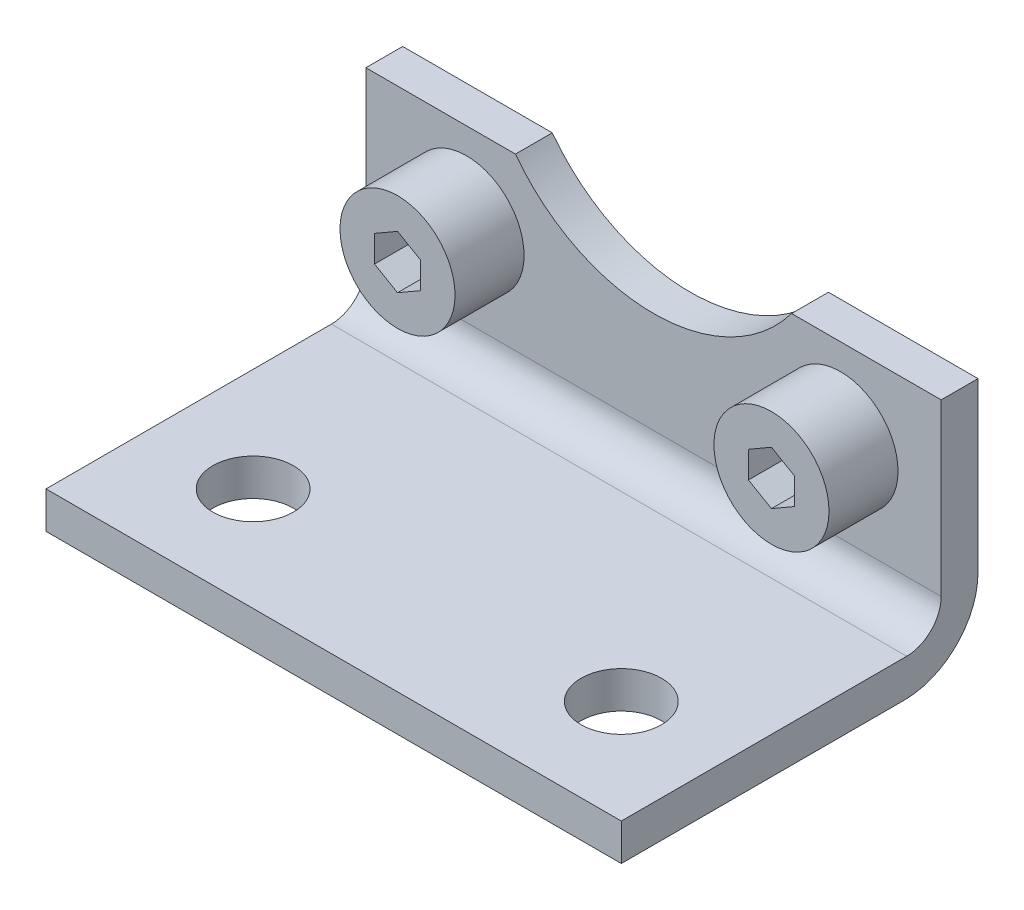
ISO-10303-21;
HEADER;
FILE_DESCRIPTION(('STEP AP214'),'2;1');
FILE_NAME('part.step','',(''),(''),'','','');
FILE_SCHEMA(('AUTOMOTIVE_DESIGN { 1 0 10303 214 1 1 1 1 }'));
ENDSEC;
DATA;
#1=APPLICATION_CONTEXT('core data for automotive mechanical design processes');
#2=APPLICATION_PROTOCOL_DEFINITION('international standard','automotive_design',2000,#1);
#3=PRODUCT_CONTEXT('',#1,'mechanical');
#4=PRODUCT('Part','Part','',(#3));
#5=PRODUCT_RELATED_PRODUCT_CATEGORY('part','',(#4));
#6=PRODUCT_DEFINITION_FORMATION('','',#4);
#7=PRODUCT_DEFINITION_CONTEXT('part definition',#1,'design');
#8=PRODUCT_DEFINITION('design','',#6,#7);
#9=PRODUCT_DEFINITION_SHAPE('','',#8);
#10=(LENGTH_UNIT() NAMED_UNIT(*) SI_UNIT(.MILLI.,.METRE.));
#11=(NAMED_UNIT(*) PLANE_ANGLE_UNIT() SI_UNIT($,.RADIAN.));
#12=(NAMED_UNIT(*) SI_UNIT($,.STERADIAN.) SOLID_ANGLE_UNIT());
#13=UNCERTAINTY_MEASURE_WITH_UNIT(LENGTH_MEASURE(1.E-05),#10,'distance_accuracy_value','');
#14=(GEOMETRIC_REPRESENTATION_CONTEXT(3) GLOBAL_UNCERTAINTY_ASSIGNED_CONTEXT((#13)) GLOBAL_UNIT_ASSIGNED_CONTEXT((#10,
#11,#12)) REPRESENTATION_CONTEXT('',''));
#15=CARTESIAN_POINT('',(0.,0.,0.));
#16=DIRECTION('',(0.,0.,1.));
#17=DIRECTION('',(1.,0.,0.));
#18=AXIS2_PLACEMENT_3D('',#15,#16,#17);
#19=CARTESIAN_POINT('',(-25.,-9.,3.1999999999999));
#20=DIRECTION('',(0.,1.,0.));
#21=DIRECTION('',(1.,0.,0.));
#22=AXIS2_PLACEMENT_3D('',#19,#20,#21);
#23=PLANE('',#22);
#24=DIRECTION('',(0.,0.,-1.));
#25=VECTOR('',#24,1.);
#26=CARTESIAN_POINT('',(-12.,-9.,3.1999999999999));
#27=LINE('',#26,#25);
#28=CARTESIAN_POINT('',(-12.,-9.,0.));
#29=VERTEX_POINT('',#28);
#30=CARTESIAN_POINT('',(-12.,-9.,3.1999999999999));
#31=VERTEX_POINT('',#30);
#32=EDGE_CURVE('E168',#29,#31,#27,.F.);
#33=ORIENTED_EDGE('',*,*,#32,.F.);
#34=DIRECTION('',(-1.,0.,0.));
#35=VECTOR('',#34,1.);
#36=CARTESIAN_POINT('',(-12.,-9.,0.));
#37=LINE('',#36,#35);
#38=CARTESIAN_POINT('',(-25.,-9.,0.));
#39=VERTEX_POINT('',#38);
#40=EDGE_CURVE('E183',#29,#39,#37,.T.);
#41=ORIENTED_EDGE('',*,*,#40,.T.);
#42=DIRECTION('',(0.,0.,1.));
#43=VECTOR('',#42,1.);
#44=CARTESIAN_POINT('',(-25.,-9.,0.));
#45=LINE('',#44,#43);
#46=CARTESIAN_POINT('',(-25.,-9.,3.1999999999999));
#47=VERTEX_POINT('',#46);
#48=EDGE_CURVE('E191',#39,#47,#45,.T.);
#49=ORIENTED_EDGE('',*,*,#48,.T.);
#50=DIRECTION('',(1.,0.,0.));
#51=VECTOR('',#50,1.);
#52=CARTESIAN_POINT('',(-25.,-9.,3.1999999999999));
#53=LINE('',#52,#51);
#54=EDGE_CURVE('E185',#31,#47,#53,.F.);
#55=ORIENTED_EDGE('',*,*,#54,.F.);
#56=EDGE_LOOP('',(#33,#41,#49,#55));
#57=FACE_BOUND('',#56,.T.);
#58=ADVANCED_FACE('F17',(#57),#23,.T.);
#59=CARTESIAN_POINT('',(12.,-9.,3.2));
#60=DIRECTION('',(0.,1.,0.));
#61=DIRECTION('',(1.,0.,0.));
#62=AXIS2_PLACEMENT_3D('',#59,#60,#61);
#63=PLANE('',#62);
#64=DIRECTION('',(0.,0.,1.));
#65=VECTOR('',#64,1.);
#66=CARTESIAN_POINT('',(12.,-9.,0.));
#67=LINE('',#66,#65);
#68=CARTESIAN_POINT('',(12.,-9.,3.19999999999998));
#69=VERTEX_POINT('',#68);
#70=CARTESIAN_POINT('',(12.,-9.,0.));
#71=VERTEX_POINT('',#70);
#72=EDGE_CURVE('E171',#69,#71,#67,.F.);
#73=ORIENTED_EDGE('',*,*,#72,.F.);
#74=DIRECTION('',(1.,0.,0.));
#75=VECTOR('',#74,1.);
#76=CARTESIAN_POINT('',(12.,-9.,3.19999999999998));
#77=LINE('',#76,#75);
#78=CARTESIAN_POINT('',(25.,-9.,3.1999999999999));
#79=VERTEX_POINT('',#78);
#80=EDGE_CURVE('E205',#79,#69,#77,.F.);
#81=ORIENTED_EDGE('',*,*,#80,.F.);
#82=DIRECTION('',(0.,0.,-1.));
#83=VECTOR('',#82,1.);
#84=CARTESIAN_POINT('',(25.,-9.,3.1999999999999));
#85=LINE('',#84,#83);
#86=CARTESIAN_POINT('',(25.,-9.,0.));
#87=VERTEX_POINT('',#86);
#88=EDGE_CURVE('E210',#87,#79,#85,.F.);
#89=ORIENTED_EDGE('',*,*,#88,.F.);
#90=DIRECTION('',(-1.,0.,0.));
#91=VECTOR('',#90,1.);
#92=CARTESIAN_POINT('',(25.,-9.,0.));
#93=LINE('',#92,#91);
#94=EDGE_CURVE('E214',#87,#71,#93,.T.);
#95=ORIENTED_EDGE('',*,*,#94,.T.);
#96=EDGE_LOOP('',(#73,#81,#89,#95));
#97=FACE_BOUND('',#96,.T.);
#98=ADVANCED_FACE('F532',(#97),#63,.T.);
#99=CARTESIAN_POINT('',(-25.,-26.8,31.));
#100=DIRECTION('',(0.,1.,0.));
#101=DIRECTION('',(1.,0.,0.));
#102=AXIS2_PLACEMENT_3D('',#99,#100,#101);
#103=PLANE('',#102);
#104=DIRECTION('',(0.,0.,1.));
#105=VECTOR('',#104,1.);
#106=CARTESIAN_POINT('',(-25.,-26.8,6.2));
#107=LINE('',#106,#105);
#108=CARTESIAN_POINT('',(-25.,-26.8,6.2));
#109=VERTEX_POINT('',#108);
#110=CARTESIAN_POINT('',(-25.,-26.8,31.));
#111=VERTEX_POINT('',#110);
#112=EDGE_CURVE('E218',#109,#111,#107,.T.);
#113=ORIENTED_EDGE('',*,*,#112,.T.);
#114=DIRECTION('',(1.,0.,0.));
#115=VECTOR('',#114,1.);
#116=CARTESIAN_POINT('',(-25.,-26.8,31.));
#117=LINE('',#116,#115);
#118=CARTESIAN_POINT('',(25.,-26.8,31.));
#119=VERTEX_POINT('',#118);
#120=EDGE_CURVE('E223',#119,#111,#117,.F.);
#121=ORIENTED_EDGE('',*,*,#120,.F.);
#122=DIRECTION('',(0.,0.,-1.));
#123=VECTOR('',#122,1.);
#124=CARTESIAN_POINT('',(25.,-26.8,31.));
#125=LINE('',#124,#123);
#126=CARTESIAN_POINT('',(25.,-26.8,6.2));
#127=VERTEX_POINT('',#126);
#128=EDGE_CURVE('E228',#127,#119,#125,.F.);
#129=ORIENTED_EDGE('',*,*,#128,.F.);
#130=DIRECTION('',(-1.,0.,0.));
#131=VECTOR('',#130,1.);
#132=CARTESIAN_POINT('',(25.,-26.8,6.2));
#133=LINE('',#132,#131);
#134=EDGE_CURVE('E232',#127,#109,#133,.T.);
#135=ORIENTED_EDGE('',*,*,#134,.T.);
#136=EDGE_LOOP('',(#113,#121,#129,#135));
#137=FACE_BOUND('',#136,.T.);
#138=CARTESIAN_POINT('',(16.,-26.8,22.));
#139=DIRECTION('',(0.,-1.,0.));
#140=DIRECTION('',(-1.42053810999903E-07,0.,0.99999999999999));
#141=AXIS2_PLACEMENT_3D('',#138,#139,#140);
#142=CIRCLE('',#141,3.5);
#143=CARTESIAN_POINT('',(15.9999995028117,-26.8,25.5));
#144=VERTEX_POINT('',#143);
#145=EDGE_CURVE('E237',#144,#144,#142,.T.);
#146=ORIENTED_EDGE('',*,*,#145,.T.);
#147=EDGE_LOOP('',(#146));
#148=FACE_BOUND('',#147,.T.);
#149=CARTESIAN_POINT('',(-16.,-26.8,22.));
#150=DIRECTION('',(0.,-1.,0.));
#151=DIRECTION('',(-1.42053924686741E-07,0.,0.99999999999999));
#152=AXIS2_PLACEMENT_3D('',#149,#150,#151);
#153=CIRCLE('',#152,3.5);
#154=CARTESIAN_POINT('',(-16.0000004971887,-26.8,25.5));
#155=VERTEX_POINT('',#154);
#156=EDGE_CURVE('E242',#155,#155,#153,.T.);
#157=ORIENTED_EDGE('',*,*,#156,.T.);
#158=EDGE_LOOP('',(#157));
#159=FACE_BOUND('',#158,.T.);
#160=ADVANCED_FACE('F537',(#137,#148,#159),#103,.T.);
#161=CARTESIAN_POINT('',(25.,-30.,31.));
#162=DIRECTION('',(0.,0.,1.));
#163=DIRECTION('',(0.,1.,0.));
#164=AXIS2_PLACEMENT_3D('',#161,#162,#163);
#165=PLANE('',#164);
#166=DIRECTION('',(0.,-1.,0.));
#167=VECTOR('',#166,1.);
#168=CARTESIAN_POINT('',(-25.,-26.8,31.));
#169=LINE('',#168,#167);
#170=CARTESIAN_POINT('',(-25.,-30.,31.));
#171=VERTEX_POINT('',#170);
#172=EDGE_CURVE('E245',#111,#171,#169,.T.);
#173=ORIENTED_EDGE('',*,*,#172,.T.);
#174=DIRECTION('',(1.,0.,0.));
#175=VECTOR('',#174,1.);
#176=CARTESIAN_POINT('',(-25.,-30.,31.));
#177=LINE('',#176,#175);
#178=CARTESIAN_POINT('',(25.,-30.,31.));
#179=VERTEX_POINT('',#178);
#180=EDGE_CURVE('E248',#179,#171,#177,.F.);
#181=ORIENTED_EDGE('',*,*,#180,.F.);
#182=DIRECTION('',(0.,1.,0.));
#183=VECTOR('',#182,1.);
#184=CARTESIAN_POINT('',(25.,-30.,31.));
#185=LINE('',#184,#183);
#186=EDGE_CURVE('E253',#119,#179,#185,.F.);
#187=ORIENTED_EDGE('',*,*,#186,.F.);
#188=ORIENTED_EDGE('',*,*,#120,.T.);
#189=EDGE_LOOP('',(#173,#181,#187,#188));
#190=FACE_BOUND('',#189,.T.);
#191=ADVANCED_FACE('F543',(#190),#165,.T.);
#192=CARTESIAN_POINT('',(-25.,-30.,6.4));
#193=DIRECTION('',(0.,-1.,0.));
#194=DIRECTION('',(1.,0.,0.));
#195=AXIS2_PLACEMENT_3D('',#192,#193,#194);
#196=PLANE('',#195);
#197=DIRECTION('',(0.,0.,-1.));
#198=VECTOR('',#197,1.);
#199=CARTESIAN_POINT('',(-25.,-30.,31.));
#200=LINE('',#199,#198);
#201=CARTESIAN_POINT('',(-25.,-30.,6.4));
#202=VERTEX_POINT('',#201);
#203=EDGE_CURVE('E257',#171,#202,#200,.T.);
#204=ORIENTED_EDGE('',*,*,#203,.T.);
#205=DIRECTION('',(1.,0.,0.));
#206=VECTOR('',#205,1.);
#207=CARTESIAN_POINT('',(-25.,-30.,6.4));
#208=LINE('',#207,#206);
#209=CARTESIAN_POINT('',(25.,-30.,6.4));
#210=VERTEX_POINT('',#209);
#211=EDGE_CURVE('E262',#210,#202,#208,.F.);
#212=ORIENTED_EDGE('',*,*,#211,.F.);
#213=DIRECTION('',(0.,0.,1.));
#214=VECTOR('',#213,1.);
#215=CARTESIAN_POINT('',(25.,-30.,6.4));
#216=LINE('',#215,#214);
#217=EDGE_CURVE('E267',#179,#210,#216,.F.);
#218=ORIENTED_EDGE('',*,*,#217,.F.);
#219=ORIENTED_EDGE('',*,*,#180,.T.);
#220=EDGE_LOOP('',(#204,#212,#218,#219));
#221=FACE_BOUND('',#220,.T.);
#222=CARTESIAN_POINT('',(16.,-30.,22.));
#223=DIRECTION('',(0.,1.,0.));
#224=DIRECTION('',(0.,0.,-1.));
#225=AXIS2_PLACEMENT_3D('',#222,#223,#224);
#226=CIRCLE('',#225,3.5);
#227=CARTESIAN_POINT('',(16.,-30.,18.5));
#228=VERTEX_POINT('',#227);
#229=EDGE_CURVE('E271',#228,#228,#226,.T.);
#230=ORIENTED_EDGE('',*,*,#229,.T.);
#231=EDGE_LOOP('',(#230));
#232=FACE_BOUND('',#231,.T.);
#233=CARTESIAN_POINT('',(-16.,-30.,22.));
#234=DIRECTION('',(0.,1.,0.));
#235=DIRECTION('',(0.,0.,-1.));
#236=AXIS2_PLACEMENT_3D('',#233,#234,#235);
#237=CIRCLE('',#236,3.5);
#238=CARTESIAN_POINT('',(-16.,-30.,18.5));
#239=VERTEX_POINT('',#238);
#240=EDGE_CURVE('E276',#239,#239,#237,.T.);
#241=ORIENTED_EDGE('',*,*,#240,.T.);
#242=EDGE_LOOP('',(#241));
#243=FACE_BOUND('',#242,.T.);
#244=ADVANCED_FACE('F547',(#221,#232,#243),#196,.T.);
#245=CARTESIAN_POINT('',(25.,-23.6,6.39999999999984));
#246=DIRECTION('',(-1.,0.,0.));
#247=DIRECTION('',(0.,0.,-1.));
#248=AXIS2_PLACEMENT_3D('',#245,#246,#247);
#249=CYLINDRICAL_SURFACE('',#248,6.39999999999984);
#250=CARTESIAN_POINT('',(-25.,-23.6,6.39999999999984));
#251=DIRECTION('',(1.,0.,0.));
#252=DIRECTION('',(0.,-1.,0.));
#253=AXIS2_PLACEMENT_3D('',#250,#251,#252);
#254=CIRCLE('',#253,6.39999999999984);
#255=CARTESIAN_POINT('',(-25.,-23.6,0.));
#256=VERTEX_POINT('',#255);
#257=EDGE_CURVE('E279',#202,#256,#254,.T.);
#258=ORIENTED_EDGE('',*,*,#257,.T.);
#259=DIRECTION('',(1.,0.,0.));
#260=VECTOR('',#259,1.);
#261=CARTESIAN_POINT('',(-25.,-23.6,0.));
#262=LINE('',#261,#260);
#263=CARTESIAN_POINT('',(25.,-23.6,0.));
#264=VERTEX_POINT('',#263);
#265=EDGE_CURVE('E282',#264,#256,#262,.F.);
#266=ORIENTED_EDGE('',*,*,#265,.F.);
#267=CARTESIAN_POINT('',(25.,-23.6,6.39999999999984));
#268=DIRECTION('',(-1.,0.,0.));
#269=DIRECTION('',(0.,0.,-1.));
#270=AXIS2_PLACEMENT_3D('',#267,#268,#269);
#271=CIRCLE('',#270,6.39999999999984);
#272=EDGE_CURVE('E177',#210,#264,#271,.F.);
#273=ORIENTED_EDGE('',*,*,#272,.F.);
#274=ORIENTED_EDGE('',*,*,#211,.T.);
#275=EDGE_LOOP('',(#258,#266,#273,#274));
#276=FACE_BOUND('',#275,.T.);
#277=ADVANCED_FACE('F551',(#276),#249,.T.);
#278=CARTESIAN_POINT('',(-25.,-23.6,0.));
#279=DIRECTION('',(0.,0.,-1.));
#280=DIRECTION('',(0.,1.,0.));
#281=AXIS2_PLACEMENT_3D('',#278,#279,#280);
#282=PLANE('',#281);
#283=CARTESIAN_POINT('',(0.,0.,0.));
#284=DIRECTION('',(0.,0.,1.));
#285=DIRECTION('',(-0.8,-0.6,0.));
#286=AXIS2_PLACEMENT_3D('',#283,#284,#285);
#287=CIRCLE('',#286,15.);
#288=EDGE_CURVE('E165',#71,#29,#287,.F.);
#289=ORIENTED_EDGE('',*,*,#288,.F.);
#290=ORIENTED_EDGE('',*,*,#94,.F.);
#291=DIRECTION('',(0.,-1.,0.));
#292=VECTOR('',#291,1.);
#293=CARTESIAN_POINT('',(25.,-9.00000000000001,0.));
#294=LINE('',#293,#292);
#295=EDGE_CURVE('E176',#264,#87,#294,.F.);
#296=ORIENTED_EDGE('',*,*,#295,.F.);
#297=ORIENTED_EDGE('',*,*,#265,.T.);
#298=DIRECTION('',(0.,1.,0.));
#299=VECTOR('',#298,1.);
#300=CARTESIAN_POINT('',(-25.,-23.6,0.));
#301=LINE('',#300,#299);
#302=EDGE_CURVE('E190',#256,#39,#301,.T.);
#303=ORIENTED_EDGE('',*,*,#302,.T.);
#304=ORIENTED_EDGE('',*,*,#40,.F.);
#305=EDGE_LOOP('',(#289,#290,#296,#297,#303,#304));
#306=FACE_BOUND('',#305,.T.);
#307=ADVANCED_FACE('F188',(#306),#282,.T.);
#308=CARTESIAN_POINT('',(-25.,-23.8000000000001,3.2));
#309=DIRECTION('',(0.,0.,1.));
#310=DIRECTION('',(1.,0.,0.));
#311=AXIS2_PLACEMENT_3D('',#308,#309,#310);
#312=PLANE('',#311);
#313=CARTESIAN_POINT('',(0.,0.,3.2));
#314=DIRECTION('',(0.,0.,-1.));
#315=DIRECTION('',(0.8,-0.600000000000001,0.));
#316=AXIS2_PLACEMENT_3D('',#313,#314,#315);
#317=CIRCLE('',#316,15.);
#318=EDGE_CURVE('E297',#31,#69,#317,.F.);
#319=ORIENTED_EDGE('',*,*,#318,.F.);
#320=ORIENTED_EDGE('',*,*,#54,.T.);
#321=DIRECTION('',(0.,-1.,0.));
#322=VECTOR('',#321,1.);
#323=CARTESIAN_POINT('',(-25.,-9.,3.1999999999999));
#324=LINE('',#323,#322);
#325=CARTESIAN_POINT('',(-25.,-23.8000000000001,3.2));
#326=VERTEX_POINT('',#325);
#327=EDGE_CURVE('E301',#47,#326,#324,.T.);
#328=ORIENTED_EDGE('',*,*,#327,.T.);
#329=DIRECTION('',(1.,0.,0.));
#330=VECTOR('',#329,1.);
#331=CARTESIAN_POINT('',(-25.,-23.8000000000001,3.2));
#332=LINE('',#331,#330);
#333=CARTESIAN_POINT('',(25.,-23.8000000000001,3.2));
#334=VERTEX_POINT('',#333);
#335=EDGE_CURVE('E306',#334,#326,#332,.F.);
#336=ORIENTED_EDGE('',*,*,#335,.F.);
#337=DIRECTION('',(0.,1.,0.));
#338=VECTOR('',#337,1.);
#339=CARTESIAN_POINT('',(25.,-23.8000000000001,3.2));
#340=LINE('',#339,#338);
#341=EDGE_CURVE('E311',#79,#334,#340,.F.);
#342=ORIENTED_EDGE('',*,*,#341,.F.);
#343=ORIENTED_EDGE('',*,*,#80,.T.);
#344=EDGE_LOOP('',(#319,#320,#328,#336,#342,#343));
#345=FACE_BOUND('',#344,.T.);
#346=CARTESIAN_POINT('',(16.25,-16.25,3.2));
#347=DIRECTION('',(0.,0.,-1.));
#348=DIRECTION('',(1.,0.,0.));
#349=AXIS2_PLACEMENT_3D('',#346,#347,#348);
#350=CIRCLE('',#349,5.);
#351=CARTESIAN_POINT('',(21.25,-16.25,3.2));
#352=VERTEX_POINT('',#351);
#353=EDGE_CURVE('E315',#352,#352,#350,.F.);
#354=ORIENTED_EDGE('',*,*,#353,.F.);
#355=EDGE_LOOP('',(#354));
#356=FACE_BOUND('',#355,.T.);
#357=CARTESIAN_POINT('',(-16.25,-16.25,3.2));
#358=DIRECTION('',(0.,0.,-1.));
#359=DIRECTION('',(1.,0.,0.));
#360=AXIS2_PLACEMENT_3D('',#357,#358,#359);
#361=CIRCLE('',#360,5.);
#362=CARTESIAN_POINT('',(-11.25,-16.25,3.2));
#363=VERTEX_POINT('',#362);
#364=EDGE_CURVE('E320',#363,#363,#361,.F.);
#365=ORIENTED_EDGE('',*,*,#364,.F.);
#366=EDGE_LOOP('',(#365));
#367=FACE_BOUND('',#366,.T.);
#368=ADVANCED_FACE('F558',(#345,#356,#367),#312,.T.);
#369=CARTESIAN_POINT('',(25.,-23.8000000000006,6.19999999999946));
#370=DIRECTION('',(-1.,0.,0.));
#371=DIRECTION('',(0.,1.63547293904738E-13,-1.));
#372=AXIS2_PLACEMENT_3D('',#369,#370,#371);
#373=CYLINDRICAL_SURFACE('',#372,2.99999999999946);
#374=CARTESIAN_POINT('',(-25.,-23.8000000000006,6.19999999999946));
#375=DIRECTION('',(-1.,0.,0.));
#376=DIRECTION('',(0.,1.63424829224852E-13,-1.));
#377=AXIS2_PLACEMENT_3D('',#374,#375,#376);
#378=CIRCLE('',#377,2.99999999999946);
#379=EDGE_CURVE('E323',#109,#326,#378,.F.);
#380=ORIENTED_EDGE('',*,*,#379,.F.);
#381=ORIENTED_EDGE('',*,*,#134,.F.);
#382=CARTESIAN_POINT('',(25.,-23.8000000000006,6.19999999999946));
#383=DIRECTION('',(1.,0.,0.));
#384=DIRECTION('',(0.,-1.,1.80892338145625E-13));
#385=AXIS2_PLACEMENT_3D('',#382,#383,#384);
#386=CIRCLE('',#385,2.99999999999946);
#387=EDGE_CURVE('E325',#127,#334,#386,.T.);
#388=ORIENTED_EDGE('',*,*,#387,.T.);
#389=ORIENTED_EDGE('',*,*,#335,.T.);
#390=EDGE_LOOP('',(#380,#381,#388,#389));
#391=FACE_BOUND('',#390,.T.);
#392=ADVANCED_FACE('F561',(#391),#373,.F.);
#393=CARTESIAN_POINT('',(25.,-30.,31.));
#394=DIRECTION('',(1.,0.,0.));
#395=DIRECTION('',(0.,0.,-1.));
#396=AXIS2_PLACEMENT_3D('',#393,#394,#395);
#397=PLANE('',#396);
#398=ORIENTED_EDGE('',*,*,#128,.T.);
#399=ORIENTED_EDGE('',*,*,#186,.T.);
#400=ORIENTED_EDGE('',*,*,#217,.T.);
#401=ORIENTED_EDGE('',*,*,#272,.T.);
#402=ORIENTED_EDGE('',*,*,#295,.T.);
#403=ORIENTED_EDGE('',*,*,#88,.T.);
#404=ORIENTED_EDGE('',*,*,#341,.T.);
#405=ORIENTED_EDGE('',*,*,#387,.F.);
#406=EDGE_LOOP('',(#398,#399,#400,#401,#402,#403,#404,#405));
#407=FACE_BOUND('',#406,.T.);
#408=ADVANCED_FACE('F565',(#407),#397,.T.);
#409=CARTESIAN_POINT('',(-25.,-30.,31.));
#410=DIRECTION('',(-1.,0.,0.));
#411=DIRECTION('',(0.,1.,0.));
#412=AXIS2_PLACEMENT_3D('',#409,#410,#411);
#413=PLANE('',#412);
#414=ORIENTED_EDGE('',*,*,#112,.F.);
#415=ORIENTED_EDGE('',*,*,#379,.T.);
#416=ORIENTED_EDGE('',*,*,#327,.F.);
#417=ORIENTED_EDGE('',*,*,#48,.F.);
#418=ORIENTED_EDGE('',*,*,#302,.F.);
#419=ORIENTED_EDGE('',*,*,#257,.F.);
#420=ORIENTED_EDGE('',*,*,#203,.F.);
#421=ORIENTED_EDGE('',*,*,#172,.F.);
#422=EDGE_LOOP('',(#414,#415,#416,#417,#418,#419,#420,#421));
#423=FACE_BOUND('',#422,.T.);
#424=ADVANCED_FACE('F569',(#423),#413,.T.);
#425=CARTESIAN_POINT('',(0.,0.,3.2));
#426=DIRECTION('',(0.,0.,-1.));
#427=DIRECTION('',(0.8,-0.6,0.));
#428=AXIS2_PLACEMENT_3D('',#425,#426,#427);
#429=CYLINDRICAL_SURFACE('',#428,15.);
#430=ORIENTED_EDGE('',*,*,#32,.T.);
#431=ORIENTED_EDGE('',*,*,#318,.T.);
#432=ORIENTED_EDGE('',*,*,#72,.T.);
#433=ORIENTED_EDGE('',*,*,#288,.T.);
#434=EDGE_LOOP('',(#430,#431,#432,#433));
#435=FACE_BOUND('',#434,.T.);
#436=ADVANCED_FACE('F167',(#435),#429,.F.);
#437=CARTESIAN_POINT('',(14.25,-17.404700538379,9.2));
#438=DIRECTION('',(1.,0.,0.));
#439=DIRECTION('',(0.,0.,-1.));
#440=AXIS2_PLACEMENT_3D('',#437,#438,#439);
#441=PLANE('',#440);
#442=DIRECTION('',(0.,1.,0.));
#443=VECTOR('',#442,1.);
#444=CARTESIAN_POINT('',(14.25,-17.404700538379,3.2));
#445=LINE('',#444,#443);
#446=CARTESIAN_POINT('',(14.25,-15.095299461621,3.19999999999995));
#447=VERTEX_POINT('',#446);
#448=CARTESIAN_POINT('',(14.25,-17.404700538379,3.2));
#449=VERTEX_POINT('',#448);
#450=EDGE_CURVE('E330',#447,#449,#445,.F.);
#451=ORIENTED_EDGE('',*,*,#450,.F.);
#452=DIRECTION('',(0.,0.,1.));
#453=VECTOR('',#452,1.);
#454=CARTESIAN_POINT('',(14.25,-15.095299461621,3.19999999999995));
#455=LINE('',#454,#453);
#456=CARTESIAN_POINT('',(14.25,-15.095299461621,9.2));
#457=VERTEX_POINT('',#456);
#458=EDGE_CURVE('E334',#457,#447,#455,.F.);
#459=ORIENTED_EDGE('',*,*,#458,.F.);
#460=DIRECTION('',(0.,-1.,0.));
#461=VECTOR('',#460,1.);
#462=CARTESIAN_POINT('',(14.25,-15.095299461621,9.2));
#463=LINE('',#462,#461);
#464=CARTESIAN_POINT('',(14.25,-17.404700538379,9.2));
#465=VERTEX_POINT('',#464);
#466=EDGE_CURVE('E339',#457,#465,#463,.T.);
#467=ORIENTED_EDGE('',*,*,#466,.T.);
#468=DIRECTION('',(0.,0.,-1.));
#469=VECTOR('',#468,1.);
#470=CARTESIAN_POINT('',(14.25,-17.404700538379,9.2));
#471=LINE('',#470,#469);
#472=EDGE_CURVE('E344',#465,#449,#471,.T.);
#473=ORIENTED_EDGE('',*,*,#472,.T.);
#474=EDGE_LOOP('',(#451,#459,#467,#473));
#475=FACE_BOUND('',#474,.T.);
#476=ADVANCED_FACE('F576',(#475),#441,.T.);
#477=CARTESIAN_POINT('',(14.25,-15.095299461621,3.19999999999995));
#478=DIRECTION('',(0.500000000000243,-0.866025403784298,0.));
#479=DIRECTION('',(0.866025403784298,0.500000000000243,0.));
#480=AXIS2_PLACEMENT_3D('',#477,#478,#479);
#481=PLANE('',#480);
#482=DIRECTION('',(0.866025403784298,0.500000000000243,0.));
#483=VECTOR('',#482,1.);
#484=CARTESIAN_POINT('',(14.25,-15.095299461621,3.19999999999996));
#485=LINE('',#484,#483);
#486=CARTESIAN_POINT('',(16.25,-13.940598923241,3.19999999999995));
#487=VERTEX_POINT('',#486);
#488=EDGE_CURVE('E349',#487,#447,#485,.F.);
#489=ORIENTED_EDGE('',*,*,#488,.F.);
#490=DIRECTION('',(0.,0.,1.));
#491=VECTOR('',#490,1.);
#492=CARTESIAN_POINT('',(16.25,-13.940598923241,3.19999999999995));
#493=LINE('',#492,#491);
#494=CARTESIAN_POINT('',(16.25,-13.940598923241,9.2));
#495=VERTEX_POINT('',#494);
#496=EDGE_CURVE('E353',#495,#487,#493,.F.);
#497=ORIENTED_EDGE('',*,*,#496,.F.);
#498=DIRECTION('',(-0.866025403784298,-0.500000000000243,0.));
#499=VECTOR('',#498,1.);
#500=CARTESIAN_POINT('',(16.25,-13.940598923241,9.2));
#501=LINE('',#500,#499);
#502=EDGE_CURVE('E358',#495,#457,#501,.T.);
#503=ORIENTED_EDGE('',*,*,#502,.T.);
#504=ORIENTED_EDGE('',*,*,#458,.T.);
#505=EDGE_LOOP('',(#489,#497,#503,#504));
#506=FACE_BOUND('',#505,.T.);
#507=ADVANCED_FACE('F579',(#506),#481,.T.);
#508=CARTESIAN_POINT('',(16.25,-13.940598923241,3.19999999999995));
#509=DIRECTION('',(-0.500000000000244,-0.866025403784298,0.));
#510=DIRECTION('',(0.866025403784298,-0.500000000000244,0.));
#511=AXIS2_PLACEMENT_3D('',#508,#509,#510);
#512=PLANE('',#511);
#513=DIRECTION('',(0.866025403784298,-0.500000000000244,0.));
#514=VECTOR('',#513,1.);
#515=CARTESIAN_POINT('',(16.25,-13.940598923241,3.19999999999995));
#516=LINE('',#515,#514);
#517=CARTESIAN_POINT('',(18.25,-15.095299461621,3.19999999999996));
#518=VERTEX_POINT('',#517);
#519=EDGE_CURVE('E363',#518,#487,#516,.F.);
#520=ORIENTED_EDGE('',*,*,#519,.F.);
#521=DIRECTION('',(0.,0.,1.));
#522=VECTOR('',#521,1.);
#523=CARTESIAN_POINT('',(18.25,-15.095299461621,3.19999999999996));
#524=LINE('',#523,#522);
#525=CARTESIAN_POINT('',(18.25,-15.095299461621,9.2));
#526=VERTEX_POINT('',#525);
#527=EDGE_CURVE('E367',#526,#518,#524,.F.);
#528=ORIENTED_EDGE('',*,*,#527,.F.);
#529=DIRECTION('',(-0.866025403784298,0.500000000000244,0.));
#530=VECTOR('',#529,1.);
#531=CARTESIAN_POINT('',(18.25,-15.095299461621,9.2));
#532=LINE('',#531,#530);
#533=EDGE_CURVE('E372',#526,#495,#532,.T.);
#534=ORIENTED_EDGE('',*,*,#533,.T.);
#535=ORIENTED_EDGE('',*,*,#496,.T.);
#536=EDGE_LOOP('',(#520,#528,#534,#535));
#537=FACE_BOUND('',#536,.T.);
#538=ADVANCED_FACE('F583',(#537),#512,.T.);
#539=CARTESIAN_POINT('',(18.25,-17.404700538379,3.19999999999996));
#540=DIRECTION('',(-1.,0.,0.));
#541=DIRECTION('',(0.,0.,1.));
#542=AXIS2_PLACEMENT_3D('',#539,#540,#541);
#543=PLANE('',#542);
#544=DIRECTION('',(0.,-1.,0.));
#545=VECTOR('',#544,1.);
#546=CARTESIAN_POINT('',(18.25,-15.095299461621,3.19999999999996));
#547=LINE('',#546,#545);
#548=CARTESIAN_POINT('',(18.25,-17.404700538379,3.19999999999997));
#549=VERTEX_POINT('',#548);
#550=EDGE_CURVE('E377',#549,#518,#547,.F.);
#551=ORIENTED_EDGE('',*,*,#550,.F.);
#552=DIRECTION('',(0.,0.,1.));
#553=VECTOR('',#552,1.);
#554=CARTESIAN_POINT('',(18.25,-17.404700538379,3.19999999999997));
#555=LINE('',#554,#553);
#556=CARTESIAN_POINT('',(18.25,-17.404700538379,9.2));
#557=VERTEX_POINT('',#556);
#558=EDGE_CURVE('E381',#557,#549,#555,.F.);
#559=ORIENTED_EDGE('',*,*,#558,.F.);
#560=DIRECTION('',(0.,1.,0.));
#561=VECTOR('',#560,1.);
#562=CARTESIAN_POINT('',(18.25,-17.404700538379,9.2));
#563=LINE('',#562,#561);
#564=EDGE_CURVE('E386',#557,#526,#563,.T.);
#565=ORIENTED_EDGE('',*,*,#564,.T.);
#566=ORIENTED_EDGE('',*,*,#527,.T.);
#567=EDGE_LOOP('',(#551,#559,#565,#566));
#568=FACE_BOUND('',#567,.T.);
#569=ADVANCED_FACE('F587',(#568),#543,.T.);
#570=CARTESIAN_POINT('',(18.25,-17.404700538379,3.19999999999997));
#571=DIRECTION('',(-0.500000000000243,0.866025403784299,0.));
#572=DIRECTION('',(-0.866025403784299,-0.500000000000243,0.));
#573=AXIS2_PLACEMENT_3D('',#570,#571,#572);
#574=PLANE('',#573);
#575=DIRECTION('',(-0.866025403784299,-0.500000000000243,0.));
#576=VECTOR('',#575,1.);
#577=CARTESIAN_POINT('',(18.25,-17.404700538379,3.19999999999997));
#578=LINE('',#577,#576);
#579=CARTESIAN_POINT('',(16.25,-18.559401076759,3.19999999999997));
#580=VERTEX_POINT('',#579);
#581=EDGE_CURVE('E391',#580,#549,#578,.F.);
#582=ORIENTED_EDGE('',*,*,#581,.F.);
#583=DIRECTION('',(0.,0.,1.));
#584=VECTOR('',#583,1.);
#585=CARTESIAN_POINT('',(16.25,-18.559401076759,3.19999999999997));
#586=LINE('',#585,#584);
#587=CARTESIAN_POINT('',(16.25,-18.559401076759,9.2));
#588=VERTEX_POINT('',#587);
#589=EDGE_CURVE('E395',#588,#580,#586,.F.);
#590=ORIENTED_EDGE('',*,*,#589,.F.);
#591=DIRECTION('',(0.866025403784299,0.500000000000243,0.));
#592=VECTOR('',#591,1.);
#593=CARTESIAN_POINT('',(16.25,-18.559401076759,9.2));
#594=LINE('',#593,#592);
#595=EDGE_CURVE('E400',#588,#557,#594,.T.);
#596=ORIENTED_EDGE('',*,*,#595,.T.);
#597=ORIENTED_EDGE('',*,*,#558,.T.);
#598=EDGE_LOOP('',(#582,#590,#596,#597));
#599=FACE_BOUND('',#598,.T.);
#600=ADVANCED_FACE('F591',(#599),#574,.T.);
#601=CARTESIAN_POINT('',(16.25,-18.559401076759,3.19999999999997));
#602=DIRECTION('',(0.500000000000243,0.866025403784298,0.));
#603=DIRECTION('',(-0.866025403784298,0.500000000000243,0.));
#604=AXIS2_PLACEMENT_3D('',#601,#602,#603);
#605=PLANE('',#604);
#606=DIRECTION('',(-0.866025403784298,0.500000000000243,0.));
#607=VECTOR('',#606,1.);
#608=CARTESIAN_POINT('',(16.25,-18.559401076759,3.19999999999997));
#609=LINE('',#608,#607);
#610=EDGE_CURVE('E405',#449,#580,#609,.F.);
#611=ORIENTED_EDGE('',*,*,#610,.F.);
#612=ORIENTED_EDGE('',*,*,#472,.F.);
#613=DIRECTION('',(0.866025403784299,-0.500000000000242,0.));
#614=VECTOR('',#613,1.);
#615=CARTESIAN_POINT('',(14.25,-17.404700538379,9.2));
#616=LINE('',#615,#614);
#617=EDGE_CURVE('E409',#465,#588,#616,.T.);
#618=ORIENTED_EDGE('',*,*,#617,.T.);
#619=ORIENTED_EDGE('',*,*,#589,.T.);
#620=EDGE_LOOP('',(#611,#612,#618,#619));
#621=FACE_BOUND('',#620,.T.);
#622=ADVANCED_FACE('F595',(#621),#605,.T.);
#623=CARTESIAN_POINT('',(11.2499996165176,-21.2499997579709,9.2));
#624=DIRECTION('',(0.,0.,1.));
#625=DIRECTION('',(1.,0.,0.));
#626=AXIS2_PLACEMENT_3D('',#623,#624,#625);
#627=PLANE('',#626);
#628=CARTESIAN_POINT('',(16.25,-16.25,9.2));
#629=DIRECTION('',(0.,0.,1.));
#630=DIRECTION('',(-0.99999999999999,-1.41914861728765E-07,0.));
#631=AXIS2_PLACEMENT_3D('',#628,#629,#630);
#632=CIRCLE('',#631,5.);
#633=CARTESIAN_POINT('',(11.2500000000001,-16.2500007095743,9.2));
#634=VERTEX_POINT('',#633);
#635=EDGE_CURVE('E414',#634,#634,#632,.T.);
#636=ORIENTED_EDGE('',*,*,#635,.T.);
#637=EDGE_LOOP('',(#636));
#638=FACE_BOUND('',#637,.T.);
#639=ORIENTED_EDGE('',*,*,#466,.F.);
#640=ORIENTED_EDGE('',*,*,#502,.F.);
#641=ORIENTED_EDGE('',*,*,#533,.F.);
#642=ORIENTED_EDGE('',*,*,#564,.F.);
#643=ORIENTED_EDGE('',*,*,#595,.F.);
#644=ORIENTED_EDGE('',*,*,#617,.F.);
#645=EDGE_LOOP('',(#639,#640,#641,#642,#643,#644));
#646=FACE_BOUND('',#645,.T.);
#647=ADVANCED_FACE('F599',(#638,#646),#627,.T.);
#648=CARTESIAN_POINT('',(14.25,-18.559401076759,3.19999999999996));
#649=DIRECTION('',(0.,0.,1.));
#650=DIRECTION('',(1.,0.,0.));
#651=AXIS2_PLACEMENT_3D('',#648,#649,#650);
#652=PLANE('',#651);
#653=ORIENTED_EDGE('',*,*,#488,.T.);
#654=ORIENTED_EDGE('',*,*,#450,.T.);
#655=ORIENTED_EDGE('',*,*,#610,.T.);
#656=ORIENTED_EDGE('',*,*,#581,.T.);
#657=ORIENTED_EDGE('',*,*,#550,.T.);
#658=ORIENTED_EDGE('',*,*,#519,.T.);
#659=EDGE_LOOP('',(#653,#654,#655,#656,#657,#658));
#660=FACE_BOUND('',#659,.T.);
#661=ADVANCED_FACE('F603',(#660),#652,.T.);
#662=CARTESIAN_POINT('',(-18.25,-17.404700538379,9.2));
#663=DIRECTION('',(1.,0.,0.));
#664=DIRECTION('',(0.,0.,-1.));
#665=AXIS2_PLACEMENT_3D('',#662,#663,#664);
#666=PLANE('',#665);
#667=DIRECTION('',(0.,1.,0.));
#668=VECTOR('',#667,1.);
#669=CARTESIAN_POINT('',(-18.25,-17.404700538379,3.2));
#670=LINE('',#669,#668);
#671=CARTESIAN_POINT('',(-18.25,-15.095299461621,3.19999999999995));
#672=VERTEX_POINT('',#671);
#673=CARTESIAN_POINT('',(-18.25,-17.404700538379,3.2));
#674=VERTEX_POINT('',#673);
#675=EDGE_CURVE('E419',#672,#674,#670,.F.);
#676=ORIENTED_EDGE('',*,*,#675,.F.);
#677=DIRECTION('',(0.,0.,1.));
#678=VECTOR('',#677,1.);
#679=CARTESIAN_POINT('',(-18.25,-15.095299461621,3.19999999999995));
#680=LINE('',#679,#678);
#681=CARTESIAN_POINT('',(-18.25,-15.095299461621,9.2));
#682=VERTEX_POINT('',#681);
#683=EDGE_CURVE('E421',#682,#672,#680,.F.);
#684=ORIENTED_EDGE('',*,*,#683,.F.);
#685=DIRECTION('',(0.,-1.,0.));
#686=VECTOR('',#685,1.);
#687=CARTESIAN_POINT('',(-18.25,-15.095299461621,9.2));
#688=LINE('',#687,#686);
#689=CARTESIAN_POINT('',(-18.25,-17.404700538379,9.2));
#690=VERTEX_POINT('',#689);
#691=EDGE_CURVE('E426',#682,#690,#688,.T.);
#692=ORIENTED_EDGE('',*,*,#691,.T.);
#693=DIRECTION('',(0.,0.,-1.));
#694=VECTOR('',#693,1.);
#695=CARTESIAN_POINT('',(-18.25,-17.404700538379,9.2));
#696=LINE('',#695,#694);
#697=EDGE_CURVE('E431',#690,#674,#696,.T.);
#698=ORIENTED_EDGE('',*,*,#697,.T.);
#699=EDGE_LOOP('',(#676,#684,#692,#698));
#700=FACE_BOUND('',#699,.T.);
#701=ADVANCED_FACE('F518',(#700),#666,.T.);
#702=CARTESIAN_POINT('',(-18.25,-15.095299461621,3.19999999999995));
#703=DIRECTION('',(0.500000000000244,-0.866025403784298,0.));
#704=DIRECTION('',(0.866025403784298,0.500000000000244,0.));
#705=AXIS2_PLACEMENT_3D('',#702,#703,#704);
#706=PLANE('',#705);
#707=DIRECTION('',(0.866025403784298,0.500000000000244,0.));
#708=VECTOR('',#707,1.);
#709=CARTESIAN_POINT('',(-18.25,-15.095299461621,3.19999999999996));
#710=LINE('',#709,#708);
#711=CARTESIAN_POINT('',(-16.25,-13.940598923241,3.19999999999995));
#712=VERTEX_POINT('',#711);
#713=EDGE_CURVE('E436',#712,#672,#710,.F.);
#714=ORIENTED_EDGE('',*,*,#713,.F.);
#715=DIRECTION('',(0.,0.,1.));
#716=VECTOR('',#715,1.);
#717=CARTESIAN_POINT('',(-16.25,-13.940598923241,3.19999999999995));
#718=LINE('',#717,#716);
#719=CARTESIAN_POINT('',(-16.25,-13.940598923241,9.2));
#720=VERTEX_POINT('',#719);
#721=EDGE_CURVE('E440',#720,#712,#718,.F.);
#722=ORIENTED_EDGE('',*,*,#721,.F.);
#723=DIRECTION('',(-0.866025403784298,-0.500000000000244,0.));
#724=VECTOR('',#723,1.);
#725=CARTESIAN_POINT('',(-16.25,-13.940598923241,9.2));
#726=LINE('',#725,#724);
#727=EDGE_CURVE('E445',#720,#682,#726,.T.);
#728=ORIENTED_EDGE('',*,*,#727,.T.);
#729=ORIENTED_EDGE('',*,*,#683,.T.);
#730=EDGE_LOOP('',(#714,#722,#728,#729));
#731=FACE_BOUND('',#730,.T.);
#732=ADVANCED_FACE('F515',(#731),#706,.T.);
#733=CARTESIAN_POINT('',(-16.25,-13.940598923241,3.19999999999995));
#734=DIRECTION('',(-0.500000000000243,-0.866025403784298,0.));
#735=DIRECTION('',(0.866025403784298,-0.500000000000243,0.));
#736=AXIS2_PLACEMENT_3D('',#733,#734,#735);
#737=PLANE('',#736);
#738=DIRECTION('',(0.866025403784298,-0.500000000000244,0.));
#739=VECTOR('',#738,1.);
#740=CARTESIAN_POINT('',(-16.25,-13.940598923241,3.19999999999995));
#741=LINE('',#740,#739);
#742=CARTESIAN_POINT('',(-14.25,-15.095299461621,3.19999999999996));
#743=VERTEX_POINT('',#742);
#744=EDGE_CURVE('E450',#743,#712,#741,.F.);
#745=ORIENTED_EDGE('',*,*,#744,.F.);
#746=DIRECTION('',(0.,0.,1.));
#747=VECTOR('',#746,1.);
#748=CARTESIAN_POINT('',(-14.25,-15.095299461621,3.19999999999996));
#749=LINE('',#748,#747);
#750=CARTESIAN_POINT('',(-14.25,-15.095299461621,9.2));
#751=VERTEX_POINT('',#750);
#752=EDGE_CURVE('E454',#751,#743,#749,.F.);
#753=ORIENTED_EDGE('',*,*,#752,.F.);
#754=DIRECTION('',(-0.866025403784298,0.500000000000243,0.));
#755=VECTOR('',#754,1.);
#756=CARTESIAN_POINT('',(-14.25,-15.095299461621,9.2));
#757=LINE('',#756,#755);
#758=EDGE_CURVE('E459',#751,#720,#757,.T.);
#759=ORIENTED_EDGE('',*,*,#758,.T.);
#760=ORIENTED_EDGE('',*,*,#721,.T.);
#761=EDGE_LOOP('',(#745,#753,#759,#760));
#762=FACE_BOUND('',#761,.T.);
#763=ADVANCED_FACE('F510',(#762),#737,.T.);
#764=CARTESIAN_POINT('',(-14.25,-17.404700538379,3.19999999999996));
#765=DIRECTION('',(-1.,0.,0.));
#766=DIRECTION('',(0.,0.,1.));
#767=AXIS2_PLACEMENT_3D('',#764,#765,#766);
#768=PLANE('',#767);
#769=DIRECTION('',(0.,-1.,0.));
#770=VECTOR('',#769,1.);
#771=CARTESIAN_POINT('',(-14.25,-15.095299461621,3.19999999999996));
#772=LINE('',#771,#770);
#773=CARTESIAN_POINT('',(-14.25,-17.404700538379,3.19999999999997));
#774=VERTEX_POINT('',#773);
#775=EDGE_CURVE('E464',#774,#743,#772,.F.);
#776=ORIENTED_EDGE('',*,*,#775,.F.);
#777=DIRECTION('',(0.,0.,1.));
#778=VECTOR('',#777,1.);
#779=CARTESIAN_POINT('',(-14.25,-17.404700538379,3.19999999999997));
#780=LINE('',#779,#778);
#781=CARTESIAN_POINT('',(-14.25,-17.404700538379,9.2));
#782=VERTEX_POINT('',#781);
#783=EDGE_CURVE('E468',#782,#774,#780,.F.);
#784=ORIENTED_EDGE('',*,*,#783,.F.);
#785=DIRECTION('',(0.,1.,0.));
#786=VECTOR('',#785,1.);
#787=CARTESIAN_POINT('',(-14.25,-17.404700538379,9.2));
#788=LINE('',#787,#786);
#789=EDGE_CURVE('E473',#782,#751,#788,.T.);
#790=ORIENTED_EDGE('',*,*,#789,.T.);
#791=ORIENTED_EDGE('',*,*,#752,.T.);
#792=EDGE_LOOP('',(#776,#784,#790,#791));
#793=FACE_BOUND('',#792,.T.);
#794=ADVANCED_FACE('F507',(#793),#768,.T.);
#795=CARTESIAN_POINT('',(-14.25,-17.404700538379,3.19999999999997));
#796=DIRECTION('',(-0.500000000000243,0.866025403784299,0.));
#797=DIRECTION('',(-0.866025403784299,-0.500000000000243,0.));
#798=AXIS2_PLACEMENT_3D('',#795,#796,#797);
#799=PLANE('',#798);
#800=DIRECTION('',(-0.866025403784298,-0.500000000000244,0.));
#801=VECTOR('',#800,1.);
#802=CARTESIAN_POINT('',(-14.25,-17.404700538379,3.19999999999997));
#803=LINE('',#802,#801);
#804=CARTESIAN_POINT('',(-16.25,-18.559401076759,3.19999999999997));
#805=VERTEX_POINT('',#804);
#806=EDGE_CURVE('E478',#805,#774,#803,.F.);
#807=ORIENTED_EDGE('',*,*,#806,.F.);
#808=DIRECTION('',(0.,0.,1.));
#809=VECTOR('',#808,1.);
#810=CARTESIAN_POINT('',(-16.25,-18.559401076759,3.19999999999997));
#811=LINE('',#810,#809);
#812=CARTESIAN_POINT('',(-16.25,-18.559401076759,9.2));
#813=VERTEX_POINT('',#812);
#814=EDGE_CURVE('E482',#813,#805,#811,.F.);
#815=ORIENTED_EDGE('',*,*,#814,.F.);
#816=DIRECTION('',(0.866025403784299,0.500000000000242,0.));
#817=VECTOR('',#816,1.);
#818=CARTESIAN_POINT('',(-16.25,-18.559401076759,9.2));
#819=LINE('',#818,#817);
#820=EDGE_CURVE('E32',#813,#782,#819,.T.);
#821=ORIENTED_EDGE('',*,*,#820,.T.);
#822=ORIENTED_EDGE('',*,*,#783,.T.);
#823=EDGE_LOOP('',(#807,#815,#821,#822));
#824=FACE_BOUND('',#823,.T.);
#825=ADVANCED_FACE('F501',(#824),#799,.T.);
#826=CARTESIAN_POINT('',(-16.25,-18.559401076759,3.19999999999997));
#827=DIRECTION('',(0.500000000000243,0.866025403784298,0.));
#828=DIRECTION('',(-0.866025403784298,0.500000000000243,0.));
#829=AXIS2_PLACEMENT_3D('',#826,#827,#828);
#830=PLANE('',#829);
#831=DIRECTION('',(-0.866025403784299,0.500000000000243,0.));
#832=VECTOR('',#831,1.);
#833=CARTESIAN_POINT('',(-16.25,-18.559401076759,3.19999999999997));
#834=LINE('',#833,#832);
#835=EDGE_CURVE('E40',#674,#805,#834,.F.);
#836=ORIENTED_EDGE('',*,*,#835,.F.);
#837=ORIENTED_EDGE('',*,*,#697,.F.);
#838=DIRECTION('',(0.866025403784299,-0.500000000000243,0.));
#839=VECTOR('',#838,1.);
#840=CARTESIAN_POINT('',(-18.25,-17.404700538379,9.2));
#841=LINE('',#840,#839);
#842=EDGE_CURVE('E25',#690,#813,#841,.T.);
#843=ORIENTED_EDGE('',*,*,#842,.T.);
#844=ORIENTED_EDGE('',*,*,#814,.T.);
#845=EDGE_LOOP('',(#836,#837,#843,#844));
#846=FACE_BOUND('',#845,.T.);
#847=ADVANCED_FACE('F499',(#846),#830,.T.);
#848=CARTESIAN_POINT('',(-21.2500003838937,-21.2499997577113,9.2));
#849=DIRECTION('',(0.,0.,1.));
#850=DIRECTION('',(1.,0.,0.));
#851=AXIS2_PLACEMENT_3D('',#848,#849,#850);
#852=PLANE('',#851);
#853=CARTESIAN_POINT('',(-16.25,-16.25,9.2));
#854=DIRECTION('',(0.,0.,1.));
#855=DIRECTION('',(-0.99999999999999,-1.42067082720133E-07,0.));
#856=AXIS2_PLACEMENT_3D('',#853,#854,#855);
#857=CIRCLE('',#856,5.);
#858=CARTESIAN_POINT('',(-21.25,-16.2500007103354,9.2));
#859=VERTEX_POINT('',#858);
#860=EDGE_CURVE('E11',#859,#859,#857,.T.);
#861=ORIENTED_EDGE('',*,*,#860,.T.);
#862=EDGE_LOOP('',(#861));
#863=FACE_BOUND('',#862,.T.);
#864=ORIENTED_EDGE('',*,*,#691,.F.);
#865=ORIENTED_EDGE('',*,*,#727,.F.);
#866=ORIENTED_EDGE('',*,*,#758,.F.);
#867=ORIENTED_EDGE('',*,*,#789,.F.);
#868=ORIENTED_EDGE('',*,*,#820,.F.);
#869=ORIENTED_EDGE('',*,*,#842,.F.);
#870=EDGE_LOOP('',(#864,#865,#866,#867,#868,#869));
#871=FACE_BOUND('',#870,.T.);
#872=ADVANCED_FACE('F519',(#863,#871),#852,.T.);
#873=CARTESIAN_POINT('',(-18.25,-18.559401076759,3.19999999999996));
#874=DIRECTION('',(0.,0.,1.));
#875=DIRECTION('',(1.,0.,0.));
#876=AXIS2_PLACEMENT_3D('',#873,#874,#875);
#877=PLANE('',#876);
#878=ORIENTED_EDGE('',*,*,#713,.T.);
#879=ORIENTED_EDGE('',*,*,#675,.T.);
#880=ORIENTED_EDGE('',*,*,#835,.T.);
#881=ORIENTED_EDGE('',*,*,#806,.T.);
#882=ORIENTED_EDGE('',*,*,#775,.T.);
#883=ORIENTED_EDGE('',*,*,#744,.T.);
#884=EDGE_LOOP('',(#878,#879,#880,#881,#882,#883));
#885=FACE_BOUND('',#884,.T.);
#886=ADVANCED_FACE('F504',(#885),#877,.T.);
#887=CARTESIAN_POINT('',(16.25,-16.25,9.2));
#888=DIRECTION('',(0.,0.,-1.));
#889=DIRECTION('',(1.,0.,0.));
#890=AXIS2_PLACEMENT_3D('',#887,#888,#889);
#891=CYLINDRICAL_SURFACE('',#890,5.);
#892=ORIENTED_EDGE('',*,*,#635,.F.);
#893=EDGE_LOOP('',(#892));
#894=FACE_BOUND('',#893,.T.);
#895=ORIENTED_EDGE('',*,*,#353,.T.);
#896=EDGE_LOOP('',(#895));
#897=FACE_BOUND('',#896,.T.);
#898=ADVANCED_FACE('F528',(#894,#897),#891,.T.);
#899=CARTESIAN_POINT('',(-16.25,-16.25,9.2));
#900=DIRECTION('',(0.,0.,-1.));
#901=DIRECTION('',(1.,0.,0.));
#902=AXIS2_PLACEMENT_3D('',#899,#900,#901);
#903=CYLINDRICAL_SURFACE('',#902,5.);
#904=ORIENTED_EDGE('',*,*,#860,.F.);
#905=EDGE_LOOP('',(#904));
#906=FACE_BOUND('',#905,.T.);
#907=ORIENTED_EDGE('',*,*,#364,.T.);
#908=EDGE_LOOP('',(#907));
#909=FACE_BOUND('',#908,.T.);
#910=ADVANCED_FACE('F649',(#906,#909),#903,.T.);
#911=CARTESIAN_POINT('',(16.,-30.,22.));
#912=DIRECTION('',(0.,1.,0.));
#913=DIRECTION('',(0.,0.,-1.));
#914=AXIS2_PLACEMENT_3D('',#911,#912,#913);
#915=CYLINDRICAL_SURFACE('',#914,3.5);
#916=ORIENTED_EDGE('',*,*,#229,.F.);
#917=EDGE_LOOP('',(#916));
#918=FACE_BOUND('',#917,.T.);
#919=ORIENTED_EDGE('',*,*,#145,.F.);
#920=EDGE_LOOP('',(#919));
#921=FACE_BOUND('',#920,.T.);
#922=ADVANCED_FACE('F659',(#918,#921),#915,.F.);
#923=CARTESIAN_POINT('',(-16.,-30.,22.));
#924=DIRECTION('',(0.,1.,0.));
#925=DIRECTION('',(0.,0.,-1.));
#926=AXIS2_PLACEMENT_3D('',#923,#924,#925);
#927=CYLINDRICAL_SURFACE('',#926,3.5);
#928=ORIENTED_EDGE('',*,*,#240,.F.);
#929=EDGE_LOOP('',(#928));
#930=FACE_BOUND('',#929,.T.);
#931=ORIENTED_EDGE('',*,*,#156,.F.);
#932=EDGE_LOOP('',(#931));
#933=FACE_BOUND('',#932,.T.);
#934=ADVANCED_FACE('F19',(#930,#933),#927,.F.);
#935=CLOSED_SHELL('',(#58,#98,#160,#191,#244,#277,#307,#368,#392,#408,#424,#436,#476,#507,#538,
#569,#600,#622,#647,#661,#701,#732,#763,#794,#825,#847,#872,#886,#898,#910,#922,#934));
#936=MANIFOLD_SOLID_BREP('B1',#935);
#937=ADVANCED_BREP_SHAPE_REPRESENTATION('',(#18,#936),#14);
#938=SHAPE_DEFINITION_REPRESENTATION(#9,#937);
ENDSEC;
END-ISO-10303-21;
